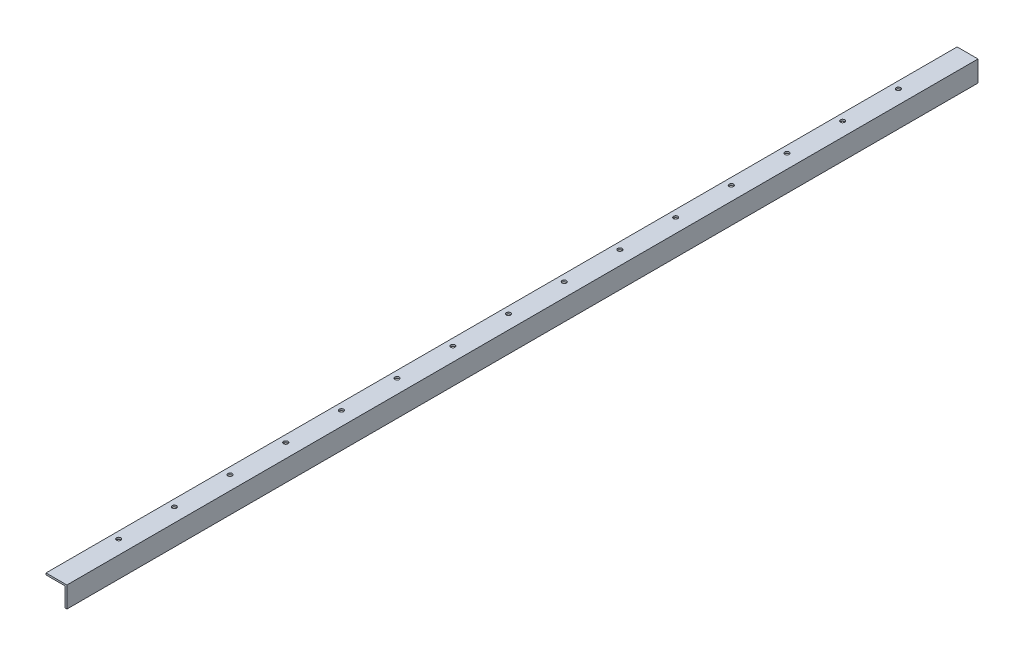
ISO-10303-21;
HEADER;
FILE_DESCRIPTION(('STEP AP214'),'2;1');
FILE_NAME('part.step','',(''),(''),'','','');
FILE_SCHEMA(('AUTOMOTIVE_DESIGN { 1 0 10303 214 1 1 1 1 }'));
ENDSEC;
DATA;
#1=APPLICATION_CONTEXT('core data for automotive mechanical design processes');
#2=APPLICATION_PROTOCOL_DEFINITION('international standard','automotive_design',2000,#1);
#3=PRODUCT_CONTEXT('',#1,'mechanical');
#4=PRODUCT('Part','Part','',(#3));
#5=PRODUCT_RELATED_PRODUCT_CATEGORY('part','',(#4));
#6=PRODUCT_DEFINITION_FORMATION('','',#4);
#7=PRODUCT_DEFINITION_CONTEXT('part definition',#1,'design');
#8=PRODUCT_DEFINITION('design','',#6,#7);
#9=PRODUCT_DEFINITION_SHAPE('','',#8);
#10=(LENGTH_UNIT() NAMED_UNIT(*) SI_UNIT(.MILLI.,.METRE.));
#11=(NAMED_UNIT(*) PLANE_ANGLE_UNIT() SI_UNIT($,.RADIAN.));
#12=(NAMED_UNIT(*) SI_UNIT($,.STERADIAN.) SOLID_ANGLE_UNIT());
#13=UNCERTAINTY_MEASURE_WITH_UNIT(LENGTH_MEASURE(1.E-05),#10,'distance_accuracy_value','');
#14=(GEOMETRIC_REPRESENTATION_CONTEXT(3) GLOBAL_UNCERTAINTY_ASSIGNED_CONTEXT((#13)) GLOBAL_UNIT_ASSIGNED_CONTEXT((#10,
#11,#12)) REPRESENTATION_CONTEXT('',''));
#15=CARTESIAN_POINT('',(0.,0.,0.));
#16=DIRECTION('',(0.,0.,1.));
#17=DIRECTION('',(1.,0.,0.));
#18=AXIS2_PLACEMENT_3D('',#15,#16,#17);
#19=CARTESIAN_POINT('',(-25.4,-41.275,1542.25625));
#20=DIRECTION('',(0.,1.,0.));
#21=DIRECTION('',(0.,0.,1.));
#22=AXIS2_PLACEMENT_3D('',#19,#20,#21);
#23=CYLINDRICAL_SURFACE('',#22,3.96874999999999);
#24=CARTESIAN_POINT('',(-25.4,-3.175,1542.25625));
#25=DIRECTION('',(0.,1.,0.));
#26=DIRECTION('',(0.,0.,1.));
#27=AXIS2_PLACEMENT_3D('',#24,#25,#26);
#28=CIRCLE('',#27,3.96874999999999);
#29=CARTESIAN_POINT('',(-25.4,-3.175,1546.225));
#30=VERTEX_POINT('',#29);
#31=EDGE_CURVE('E52',#30,#30,#28,.T.);
#32=ORIENTED_EDGE('',*,*,#31,.F.);
#33=EDGE_LOOP('',(#32));
#34=FACE_BOUND('',#33,.T.);
#35=CARTESIAN_POINT('',(-25.4,0.,1542.25625));
#36=DIRECTION('',(0.,-1.,0.));
#37=DIRECTION('',(1.,0.,0.));
#38=AXIS2_PLACEMENT_3D('',#35,#36,#37);
#39=CIRCLE('',#38,3.96874999999999);
#40=CARTESIAN_POINT('',(-21.43125,0.,1542.25625));
#41=VERTEX_POINT('',#40);
#42=EDGE_CURVE('E13',#41,#41,#39,.T.);
#43=ORIENTED_EDGE('',*,*,#42,.F.);
#44=EDGE_LOOP('',(#43));
#45=FACE_BOUND('',#44,.T.);
#46=ADVANCED_FACE('F44',(#34,#45),#23,.F.);
#47=CARTESIAN_POINT('',(-25.4,-41.275,1440.65625));
#48=DIRECTION('',(0.,1.,0.));
#49=DIRECTION('',(0.,0.,1.));
#50=AXIS2_PLACEMENT_3D('',#47,#48,#49);
#51=CYLINDRICAL_SURFACE('',#50,3.96874999999999);
#52=CARTESIAN_POINT('',(-25.4,-3.175,1440.65625));
#53=DIRECTION('',(0.,1.,0.));
#54=DIRECTION('',(0.,0.,1.));
#55=AXIS2_PLACEMENT_3D('',#52,#53,#54);
#56=CIRCLE('',#55,3.96874999999999);
#57=CARTESIAN_POINT('',(-25.4,-3.175,1444.625));
#58=VERTEX_POINT('',#57);
#59=EDGE_CURVE('E220',#58,#58,#56,.T.);
#60=ORIENTED_EDGE('',*,*,#59,.F.);
#61=EDGE_LOOP('',(#60));
#62=FACE_BOUND('',#61,.T.);
#63=CARTESIAN_POINT('',(-25.4,0.,1440.65625));
#64=DIRECTION('',(0.,-1.,0.));
#65=DIRECTION('',(1.,0.,0.));
#66=AXIS2_PLACEMENT_3D('',#63,#64,#65);
#67=CIRCLE('',#66,3.96874999999999);
#68=CARTESIAN_POINT('',(-21.43125,0.,1440.65625));
#69=VERTEX_POINT('',#68);
#70=EDGE_CURVE('E223',#69,#69,#67,.T.);
#71=ORIENTED_EDGE('',*,*,#70,.F.);
#72=EDGE_LOOP('',(#71));
#73=FACE_BOUND('',#72,.T.);
#74=ADVANCED_FACE('F231',(#62,#73),#51,.F.);
#75=CARTESIAN_POINT('',(-25.4,-41.275,1339.05625));
#76=DIRECTION('',(0.,1.,0.));
#77=DIRECTION('',(0.,0.,1.));
#78=AXIS2_PLACEMENT_3D('',#75,#76,#77);
#79=CYLINDRICAL_SURFACE('',#78,3.96874999999999);
#80=CARTESIAN_POINT('',(-25.4,-3.175,1339.05625));
#81=DIRECTION('',(0.,1.,0.));
#82=DIRECTION('',(0.,0.,1.));
#83=AXIS2_PLACEMENT_3D('',#80,#81,#82);
#84=CIRCLE('',#83,3.96874999999999);
#85=CARTESIAN_POINT('',(-25.4,-3.175,1343.025));
#86=VERTEX_POINT('',#85);
#87=EDGE_CURVE('E214',#86,#86,#84,.T.);
#88=ORIENTED_EDGE('',*,*,#87,.F.);
#89=EDGE_LOOP('',(#88));
#90=FACE_BOUND('',#89,.T.);
#91=CARTESIAN_POINT('',(-25.4,0.,1339.05625));
#92=DIRECTION('',(0.,-1.,0.));
#93=DIRECTION('',(1.,0.,0.));
#94=AXIS2_PLACEMENT_3D('',#91,#92,#93);
#95=CIRCLE('',#94,3.96874999999999);
#96=CARTESIAN_POINT('',(-21.43125,0.,1339.05625));
#97=VERTEX_POINT('',#96);
#98=EDGE_CURVE('E217',#97,#97,#95,.T.);
#99=ORIENTED_EDGE('',*,*,#98,.F.);
#100=EDGE_LOOP('',(#99));
#101=FACE_BOUND('',#100,.T.);
#102=ADVANCED_FACE('F291',(#90,#101),#79,.F.);
#103=CARTESIAN_POINT('',(-25.4,-41.275,1237.45625));
#104=DIRECTION('',(0.,1.,0.));
#105=DIRECTION('',(0.,0.,1.));
#106=AXIS2_PLACEMENT_3D('',#103,#104,#105);
#107=CYLINDRICAL_SURFACE('',#106,3.96874999999999);
#108=CARTESIAN_POINT('',(-25.4,-3.175,1237.45625));
#109=DIRECTION('',(0.,1.,0.));
#110=DIRECTION('',(0.,0.,1.));
#111=AXIS2_PLACEMENT_3D('',#108,#109,#110);
#112=CIRCLE('',#111,3.96874999999999);
#113=CARTESIAN_POINT('',(-25.4,-3.175,1241.425));
#114=VERTEX_POINT('',#113);
#115=EDGE_CURVE('E208',#114,#114,#112,.T.);
#116=ORIENTED_EDGE('',*,*,#115,.F.);
#117=EDGE_LOOP('',(#116));
#118=FACE_BOUND('',#117,.T.);
#119=CARTESIAN_POINT('',(-25.4,0.,1237.45625));
#120=DIRECTION('',(0.,-1.,0.));
#121=DIRECTION('',(1.,0.,0.));
#122=AXIS2_PLACEMENT_3D('',#119,#120,#121);
#123=CIRCLE('',#122,3.96874999999999);
#124=CARTESIAN_POINT('',(-21.43125,0.,1237.45625));
#125=VERTEX_POINT('',#124);
#126=EDGE_CURVE('E211',#125,#125,#123,.T.);
#127=ORIENTED_EDGE('',*,*,#126,.F.);
#128=EDGE_LOOP('',(#127));
#129=FACE_BOUND('',#128,.T.);
#130=ADVANCED_FACE('F287',(#118,#129),#107,.F.);
#131=CARTESIAN_POINT('',(-25.4,-41.275,1135.85625));
#132=DIRECTION('',(0.,1.,0.));
#133=DIRECTION('',(0.,0.,1.));
#134=AXIS2_PLACEMENT_3D('',#131,#132,#133);
#135=CYLINDRICAL_SURFACE('',#134,3.96874999999999);
#136=CARTESIAN_POINT('',(-25.4,-3.175,1135.85625));
#137=DIRECTION('',(0.,1.,0.));
#138=DIRECTION('',(0.,0.,1.));
#139=AXIS2_PLACEMENT_3D('',#136,#137,#138);
#140=CIRCLE('',#139,3.96874999999999);
#141=CARTESIAN_POINT('',(-25.4,-3.175,1139.825));
#142=VERTEX_POINT('',#141);
#143=EDGE_CURVE('E202',#142,#142,#140,.T.);
#144=ORIENTED_EDGE('',*,*,#143,.F.);
#145=EDGE_LOOP('',(#144));
#146=FACE_BOUND('',#145,.T.);
#147=CARTESIAN_POINT('',(-25.4,0.,1135.85625));
#148=DIRECTION('',(0.,-1.,0.));
#149=DIRECTION('',(1.,0.,0.));
#150=AXIS2_PLACEMENT_3D('',#147,#148,#149);
#151=CIRCLE('',#150,3.96874999999999);
#152=CARTESIAN_POINT('',(-21.43125,0.,1135.85625));
#153=VERTEX_POINT('',#152);
#154=EDGE_CURVE('E205',#153,#153,#151,.T.);
#155=ORIENTED_EDGE('',*,*,#154,.F.);
#156=EDGE_LOOP('',(#155));
#157=FACE_BOUND('',#156,.T.);
#158=ADVANCED_FACE('F283',(#146,#157),#135,.F.);
#159=CARTESIAN_POINT('',(-25.4,-41.275,1034.25625));
#160=DIRECTION('',(0.,1.,0.));
#161=DIRECTION('',(0.,0.,1.));
#162=AXIS2_PLACEMENT_3D('',#159,#160,#161);
#163=CYLINDRICAL_SURFACE('',#162,3.96874999999999);
#164=CARTESIAN_POINT('',(-25.4,-3.175,1034.25625));
#165=DIRECTION('',(0.,1.,0.));
#166=DIRECTION('',(0.,0.,1.));
#167=AXIS2_PLACEMENT_3D('',#164,#165,#166);
#168=CIRCLE('',#167,3.96874999999999);
#169=CARTESIAN_POINT('',(-25.4,-3.175,1038.225));
#170=VERTEX_POINT('',#169);
#171=EDGE_CURVE('E196',#170,#170,#168,.T.);
#172=ORIENTED_EDGE('',*,*,#171,.F.);
#173=EDGE_LOOP('',(#172));
#174=FACE_BOUND('',#173,.T.);
#175=CARTESIAN_POINT('',(-25.4,0.,1034.25625));
#176=DIRECTION('',(0.,-1.,0.));
#177=DIRECTION('',(1.,0.,0.));
#178=AXIS2_PLACEMENT_3D('',#175,#176,#177);
#179=CIRCLE('',#178,3.96874999999999);
#180=CARTESIAN_POINT('',(-21.43125,0.,1034.25625));
#181=VERTEX_POINT('',#180);
#182=EDGE_CURVE('E199',#181,#181,#179,.T.);
#183=ORIENTED_EDGE('',*,*,#182,.F.);
#184=EDGE_LOOP('',(#183));
#185=FACE_BOUND('',#184,.T.);
#186=ADVANCED_FACE('F279',(#174,#185),#163,.F.);
#187=CARTESIAN_POINT('',(-25.4,-41.275,932.65625));
#188=DIRECTION('',(0.,1.,0.));
#189=DIRECTION('',(0.,0.,1.));
#190=AXIS2_PLACEMENT_3D('',#187,#188,#189);
#191=CYLINDRICAL_SURFACE('',#190,3.96874999999999);
#192=CARTESIAN_POINT('',(-25.4,-3.175,932.65625));
#193=DIRECTION('',(0.,1.,0.));
#194=DIRECTION('',(0.,0.,1.));
#195=AXIS2_PLACEMENT_3D('',#192,#193,#194);
#196=CIRCLE('',#195,3.96874999999999);
#197=CARTESIAN_POINT('',(-25.4,-3.175,936.625));
#198=VERTEX_POINT('',#197);
#199=EDGE_CURVE('E190',#198,#198,#196,.T.);
#200=ORIENTED_EDGE('',*,*,#199,.F.);
#201=EDGE_LOOP('',(#200));
#202=FACE_BOUND('',#201,.T.);
#203=CARTESIAN_POINT('',(-25.4,0.,932.65625));
#204=DIRECTION('',(0.,-1.,0.));
#205=DIRECTION('',(1.,0.,0.));
#206=AXIS2_PLACEMENT_3D('',#203,#204,#205);
#207=CIRCLE('',#206,3.96874999999999);
#208=CARTESIAN_POINT('',(-21.43125,0.,932.65625));
#209=VERTEX_POINT('',#208);
#210=EDGE_CURVE('E193',#209,#209,#207,.T.);
#211=ORIENTED_EDGE('',*,*,#210,.F.);
#212=EDGE_LOOP('',(#211));
#213=FACE_BOUND('',#212,.T.);
#214=ADVANCED_FACE('F275',(#202,#213),#191,.F.);
#215=CARTESIAN_POINT('',(-25.4,-41.275,831.05625));
#216=DIRECTION('',(0.,1.,0.));
#217=DIRECTION('',(0.,0.,1.));
#218=AXIS2_PLACEMENT_3D('',#215,#216,#217);
#219=CYLINDRICAL_SURFACE('',#218,3.96874999999999);
#220=CARTESIAN_POINT('',(-25.4,-3.175,831.05625));
#221=DIRECTION('',(0.,1.,0.));
#222=DIRECTION('',(0.,0.,1.));
#223=AXIS2_PLACEMENT_3D('',#220,#221,#222);
#224=CIRCLE('',#223,3.96874999999999);
#225=CARTESIAN_POINT('',(-25.4,-3.175,835.025));
#226=VERTEX_POINT('',#225);
#227=EDGE_CURVE('E184',#226,#226,#224,.T.);
#228=ORIENTED_EDGE('',*,*,#227,.F.);
#229=EDGE_LOOP('',(#228));
#230=FACE_BOUND('',#229,.T.);
#231=CARTESIAN_POINT('',(-25.4,0.,831.05625));
#232=DIRECTION('',(0.,-1.,0.));
#233=DIRECTION('',(1.,0.,0.));
#234=AXIS2_PLACEMENT_3D('',#231,#232,#233);
#235=CIRCLE('',#234,3.96874999999999);
#236=CARTESIAN_POINT('',(-21.43125,0.,831.05625));
#237=VERTEX_POINT('',#236);
#238=EDGE_CURVE('E187',#237,#237,#235,.T.);
#239=ORIENTED_EDGE('',*,*,#238,.F.);
#240=EDGE_LOOP('',(#239));
#241=FACE_BOUND('',#240,.T.);
#242=ADVANCED_FACE('F271',(#230,#241),#219,.F.);
#243=CARTESIAN_POINT('',(-25.4,-41.275,729.45625));
#244=DIRECTION('',(0.,1.,0.));
#245=DIRECTION('',(0.,0.,1.));
#246=AXIS2_PLACEMENT_3D('',#243,#244,#245);
#247=CYLINDRICAL_SURFACE('',#246,3.96874999999999);
#248=CARTESIAN_POINT('',(-25.4,-3.175,729.45625));
#249=DIRECTION('',(0.,1.,0.));
#250=DIRECTION('',(0.,0.,1.));
#251=AXIS2_PLACEMENT_3D('',#248,#249,#250);
#252=CIRCLE('',#251,3.96874999999999);
#253=CARTESIAN_POINT('',(-25.4,-3.175,733.425));
#254=VERTEX_POINT('',#253);
#255=EDGE_CURVE('E178',#254,#254,#252,.T.);
#256=ORIENTED_EDGE('',*,*,#255,.F.);
#257=EDGE_LOOP('',(#256));
#258=FACE_BOUND('',#257,.T.);
#259=CARTESIAN_POINT('',(-25.4,0.,729.45625));
#260=DIRECTION('',(0.,-1.,0.));
#261=DIRECTION('',(1.,0.,0.));
#262=AXIS2_PLACEMENT_3D('',#259,#260,#261);
#263=CIRCLE('',#262,3.96874999999999);
#264=CARTESIAN_POINT('',(-21.43125,0.,729.45625));
#265=VERTEX_POINT('',#264);
#266=EDGE_CURVE('E181',#265,#265,#263,.T.);
#267=ORIENTED_EDGE('',*,*,#266,.F.);
#268=EDGE_LOOP('',(#267));
#269=FACE_BOUND('',#268,.T.);
#270=ADVANCED_FACE('F267',(#258,#269),#247,.F.);
#271=CARTESIAN_POINT('',(-25.4,-41.275,627.85625));
#272=DIRECTION('',(0.,1.,0.));
#273=DIRECTION('',(0.,0.,1.));
#274=AXIS2_PLACEMENT_3D('',#271,#272,#273);
#275=CYLINDRICAL_SURFACE('',#274,3.96874999999999);
#276=CARTESIAN_POINT('',(-25.4,-3.175,627.85625));
#277=DIRECTION('',(0.,1.,0.));
#278=DIRECTION('',(0.,0.,1.));
#279=AXIS2_PLACEMENT_3D('',#276,#277,#278);
#280=CIRCLE('',#279,3.96874999999999);
#281=CARTESIAN_POINT('',(-25.4,-3.175,631.825));
#282=VERTEX_POINT('',#281);
#283=EDGE_CURVE('E172',#282,#282,#280,.T.);
#284=ORIENTED_EDGE('',*,*,#283,.F.);
#285=EDGE_LOOP('',(#284));
#286=FACE_BOUND('',#285,.T.);
#287=CARTESIAN_POINT('',(-25.4,0.,627.85625));
#288=DIRECTION('',(0.,-1.,0.));
#289=DIRECTION('',(1.,0.,0.));
#290=AXIS2_PLACEMENT_3D('',#287,#288,#289);
#291=CIRCLE('',#290,3.96874999999999);
#292=CARTESIAN_POINT('',(-21.43125,0.,627.85625));
#293=VERTEX_POINT('',#292);
#294=EDGE_CURVE('E175',#293,#293,#291,.T.);
#295=ORIENTED_EDGE('',*,*,#294,.F.);
#296=EDGE_LOOP('',(#295));
#297=FACE_BOUND('',#296,.T.);
#298=ADVANCED_FACE('F263',(#286,#297),#275,.F.);
#299=CARTESIAN_POINT('',(-25.4,-41.275,526.25625));
#300=DIRECTION('',(0.,1.,0.));
#301=DIRECTION('',(0.,0.,1.));
#302=AXIS2_PLACEMENT_3D('',#299,#300,#301);
#303=CYLINDRICAL_SURFACE('',#302,3.96874999999999);
#304=CARTESIAN_POINT('',(-25.4,-3.175,526.25625));
#305=DIRECTION('',(0.,1.,0.));
#306=DIRECTION('',(0.,0.,1.));
#307=AXIS2_PLACEMENT_3D('',#304,#305,#306);
#308=CIRCLE('',#307,3.96874999999999);
#309=CARTESIAN_POINT('',(-25.4,-3.175,530.225));
#310=VERTEX_POINT('',#309);
#311=EDGE_CURVE('E166',#310,#310,#308,.T.);
#312=ORIENTED_EDGE('',*,*,#311,.F.);
#313=EDGE_LOOP('',(#312));
#314=FACE_BOUND('',#313,.T.);
#315=CARTESIAN_POINT('',(-25.4,0.,526.25625));
#316=DIRECTION('',(0.,-1.,0.));
#317=DIRECTION('',(1.,0.,0.));
#318=AXIS2_PLACEMENT_3D('',#315,#316,#317);
#319=CIRCLE('',#318,3.96874999999999);
#320=CARTESIAN_POINT('',(-21.43125,0.,526.25625));
#321=VERTEX_POINT('',#320);
#322=EDGE_CURVE('E169',#321,#321,#319,.T.);
#323=ORIENTED_EDGE('',*,*,#322,.F.);
#324=EDGE_LOOP('',(#323));
#325=FACE_BOUND('',#324,.T.);
#326=ADVANCED_FACE('F259',(#314,#325),#303,.F.);
#327=CARTESIAN_POINT('',(-25.4,-41.275,424.65625));
#328=DIRECTION('',(0.,1.,0.));
#329=DIRECTION('',(0.,0.,1.));
#330=AXIS2_PLACEMENT_3D('',#327,#328,#329);
#331=CYLINDRICAL_SURFACE('',#330,3.96874999999999);
#332=CARTESIAN_POINT('',(-25.4,-3.175,424.65625));
#333=DIRECTION('',(0.,1.,0.));
#334=DIRECTION('',(0.,0.,1.));
#335=AXIS2_PLACEMENT_3D('',#332,#333,#334);
#336=CIRCLE('',#335,3.96874999999999);
#337=CARTESIAN_POINT('',(-25.4,-3.175,428.625));
#338=VERTEX_POINT('',#337);
#339=EDGE_CURVE('E160',#338,#338,#336,.T.);
#340=ORIENTED_EDGE('',*,*,#339,.F.);
#341=EDGE_LOOP('',(#340));
#342=FACE_BOUND('',#341,.T.);
#343=CARTESIAN_POINT('',(-25.4,0.,424.65625));
#344=DIRECTION('',(0.,-1.,0.));
#345=DIRECTION('',(1.,0.,0.));
#346=AXIS2_PLACEMENT_3D('',#343,#344,#345);
#347=CIRCLE('',#346,3.96874999999999);
#348=CARTESIAN_POINT('',(-21.43125,0.,424.65625));
#349=VERTEX_POINT('',#348);
#350=EDGE_CURVE('E163',#349,#349,#347,.T.);
#351=ORIENTED_EDGE('',*,*,#350,.F.);
#352=EDGE_LOOP('',(#351));
#353=FACE_BOUND('',#352,.T.);
#354=ADVANCED_FACE('F255',(#342,#353),#331,.F.);
#355=CARTESIAN_POINT('',(-25.4,-41.275,323.05625));
#356=DIRECTION('',(0.,1.,0.));
#357=DIRECTION('',(0.,0.,1.));
#358=AXIS2_PLACEMENT_3D('',#355,#356,#357);
#359=CYLINDRICAL_SURFACE('',#358,3.96874999999999);
#360=CARTESIAN_POINT('',(-25.4,-3.175,323.05625));
#361=DIRECTION('',(0.,1.,0.));
#362=DIRECTION('',(0.,0.,1.));
#363=AXIS2_PLACEMENT_3D('',#360,#361,#362);
#364=CIRCLE('',#363,3.96874999999999);
#365=CARTESIAN_POINT('',(-25.4,-3.175,327.025));
#366=VERTEX_POINT('',#365);
#367=EDGE_CURVE('E150',#366,#366,#364,.T.);
#368=ORIENTED_EDGE('',*,*,#367,.F.);
#369=EDGE_LOOP('',(#368));
#370=FACE_BOUND('',#369,.T.);
#371=CARTESIAN_POINT('',(-25.4,0.,323.05625));
#372=DIRECTION('',(0.,-1.,0.));
#373=DIRECTION('',(1.,0.,0.));
#374=AXIS2_PLACEMENT_3D('',#371,#372,#373);
#375=CIRCLE('',#374,3.96874999999999);
#376=CARTESIAN_POINT('',(-21.43125,0.,323.05625));
#377=VERTEX_POINT('',#376);
#378=EDGE_CURVE('E157',#377,#377,#375,.T.);
#379=ORIENTED_EDGE('',*,*,#378,.F.);
#380=EDGE_LOOP('',(#379));
#381=FACE_BOUND('',#380,.T.);
#382=ADVANCED_FACE('F246',(#370,#381),#359,.F.);
#383=CARTESIAN_POINT('',(0.,-38.1,1662.1125));
#384=DIRECTION('',(-1.,0.,0.));
#385=DIRECTION('',(0.,0.,1.));
#386=AXIS2_PLACEMENT_3D('',#383,#384,#385);
#387=PLANE('',#386);
#388=DIRECTION('',(0.,1.,0.));
#389=VECTOR('',#388,1.);
#390=CARTESIAN_POINT('',(0.,-38.1,0.));
#391=LINE('',#390,#389);
#392=CARTESIAN_POINT('',(0.,-38.1,0.));
#393=VERTEX_POINT('',#392);
#394=CARTESIAN_POINT('',(0.,0.,0.));
#395=VERTEX_POINT('',#394);
#396=EDGE_CURVE('E130',#393,#395,#391,.T.);
#397=ORIENTED_EDGE('',*,*,#396,.T.);
#398=DIRECTION('',(0.,0.,-1.));
#399=VECTOR('',#398,1.);
#400=CARTESIAN_POINT('',(0.,0.,1662.1125));
#401=LINE('',#400,#399);
#402=CARTESIAN_POINT('',(0.,0.,1662.1125));
#403=VERTEX_POINT('',#402);
#404=EDGE_CURVE('E148',#403,#395,#401,.T.);
#405=ORIENTED_EDGE('',*,*,#404,.F.);
#406=DIRECTION('',(0.,1.,0.));
#407=VECTOR('',#406,1.);
#408=CARTESIAN_POINT('',(0.,-38.1,1662.1125));
#409=LINE('',#408,#407);
#410=CARTESIAN_POINT('',(0.,-38.1,1662.1125));
#411=VERTEX_POINT('',#410);
#412=EDGE_CURVE('E141',#411,#403,#409,.T.);
#413=ORIENTED_EDGE('',*,*,#412,.F.);
#414=DIRECTION('',(0.,0.,-1.));
#415=VECTOR('',#414,1.);
#416=CARTESIAN_POINT('',(0.,-38.1,1662.1125));
#417=LINE('',#416,#415);
#418=EDGE_CURVE('E126',#411,#393,#417,.T.);
#419=ORIENTED_EDGE('',*,*,#418,.T.);
#420=EDGE_LOOP('',(#397,#405,#413,#419));
#421=FACE_BOUND('',#420,.T.);
#422=ADVANCED_FACE('F237',(#421),#387,.F.);
#423=CARTESIAN_POINT('',(0.,0.,1662.1125));
#424=DIRECTION('',(0.,-1.,0.));
#425=DIRECTION('',(1.,0.,0.));
#426=AXIS2_PLACEMENT_3D('',#423,#424,#425);
#427=PLANE('',#426);
#428=CARTESIAN_POINT('',(-25.4,0.,221.45625));
#429=DIRECTION('',(0.,-1.,0.));
#430=DIRECTION('',(1.,0.,0.));
#431=AXIS2_PLACEMENT_3D('',#428,#429,#430);
#432=CIRCLE('',#431,3.96874999999999);
#433=CARTESIAN_POINT('',(-21.43125,0.,221.45625));
#434=VERTEX_POINT('',#433);
#435=EDGE_CURVE('E154',#434,#434,#432,.T.);
#436=ORIENTED_EDGE('',*,*,#435,.T.);
#437=EDGE_LOOP('',(#436));
#438=FACE_BOUND('',#437,.T.);
#439=CARTESIAN_POINT('',(-25.4,0.,119.85625));
#440=DIRECTION('',(0.,-1.,0.));
#441=DIRECTION('',(1.,0.,0.));
#442=AXIS2_PLACEMENT_3D('',#439,#440,#441);
#443=CIRCLE('',#442,3.96874999999999);
#444=CARTESIAN_POINT('',(-21.43125,0.,119.85625));
#445=VERTEX_POINT('',#444);
#446=EDGE_CURVE('E134',#445,#445,#443,.T.);
#447=ORIENTED_EDGE('',*,*,#446,.T.);
#448=EDGE_LOOP('',(#447));
#449=FACE_BOUND('',#448,.T.);
#450=DIRECTION('',(-1.,0.,0.));
#451=VECTOR('',#450,1.);
#452=CARTESIAN_POINT('',(0.,0.,0.));
#453=LINE('',#452,#451);
#454=CARTESIAN_POINT('',(-38.1,0.,0.));
#455=VERTEX_POINT('',#454);
#456=EDGE_CURVE('E133',#395,#455,#453,.T.);
#457=ORIENTED_EDGE('',*,*,#456,.T.);
#458=DIRECTION('',(0.,0.,-1.));
#459=VECTOR('',#458,1.);
#460=CARTESIAN_POINT('',(-38.1,0.,1662.1125));
#461=LINE('',#460,#459);
#462=CARTESIAN_POINT('',(-38.1,0.,1662.1125));
#463=VERTEX_POINT('',#462);
#464=EDGE_CURVE('E145',#463,#455,#461,.T.);
#465=ORIENTED_EDGE('',*,*,#464,.F.);
#466=DIRECTION('',(-1.,0.,0.));
#467=VECTOR('',#466,1.);
#468=CARTESIAN_POINT('',(0.,0.,1662.1125));
#469=LINE('',#468,#467);
#470=EDGE_CURVE('E98',#403,#463,#469,.T.);
#471=ORIENTED_EDGE('',*,*,#470,.F.);
#472=ORIENTED_EDGE('',*,*,#404,.T.);
#473=EDGE_LOOP('',(#457,#465,#471,#472));
#474=FACE_BOUND('',#473,.T.);
#475=ORIENTED_EDGE('',*,*,#378,.T.);
#476=EDGE_LOOP('',(#475));
#477=FACE_BOUND('',#476,.T.);
#478=ORIENTED_EDGE('',*,*,#350,.T.);
#479=EDGE_LOOP('',(#478));
#480=FACE_BOUND('',#479,.T.);
#481=ORIENTED_EDGE('',*,*,#322,.T.);
#482=EDGE_LOOP('',(#481));
#483=FACE_BOUND('',#482,.T.);
#484=ORIENTED_EDGE('',*,*,#294,.T.);
#485=EDGE_LOOP('',(#484));
#486=FACE_BOUND('',#485,.T.);
#487=ORIENTED_EDGE('',*,*,#266,.T.);
#488=EDGE_LOOP('',(#487));
#489=FACE_BOUND('',#488,.T.);
#490=ORIENTED_EDGE('',*,*,#238,.T.);
#491=EDGE_LOOP('',(#490));
#492=FACE_BOUND('',#491,.T.);
#493=ORIENTED_EDGE('',*,*,#210,.T.);
#494=EDGE_LOOP('',(#493));
#495=FACE_BOUND('',#494,.T.);
#496=ORIENTED_EDGE('',*,*,#182,.T.);
#497=EDGE_LOOP('',(#496));
#498=FACE_BOUND('',#497,.T.);
#499=ORIENTED_EDGE('',*,*,#154,.T.);
#500=EDGE_LOOP('',(#499));
#501=FACE_BOUND('',#500,.T.);
#502=ORIENTED_EDGE('',*,*,#126,.T.);
#503=EDGE_LOOP('',(#502));
#504=FACE_BOUND('',#503,.T.);
#505=ORIENTED_EDGE('',*,*,#98,.T.);
#506=EDGE_LOOP('',(#505));
#507=FACE_BOUND('',#506,.T.);
#508=ORIENTED_EDGE('',*,*,#70,.T.);
#509=EDGE_LOOP('',(#508));
#510=FACE_BOUND('',#509,.T.);
#511=ORIENTED_EDGE('',*,*,#42,.T.);
#512=EDGE_LOOP('',(#511));
#513=FACE_BOUND('',#512,.T.);
#514=ADVANCED_FACE('F234',(#438,#449,#474,#477,#480,#483,#486,#489,#492,#495,#498,#501,#504,
#507,#510,#513),#427,.F.);
#515=CARTESIAN_POINT('',(-38.1,0.,1662.1125));
#516=DIRECTION('',(1.,0.,0.));
#517=DIRECTION('',(0.,0.,-1.));
#518=AXIS2_PLACEMENT_3D('',#515,#516,#517);
#519=PLANE('',#518);
#520=DIRECTION('',(0.,-1.,0.));
#521=VECTOR('',#520,1.);
#522=CARTESIAN_POINT('',(-38.1,0.,0.));
#523=LINE('',#522,#521);
#524=CARTESIAN_POINT('',(-38.1,-3.17500000000001,0.));
#525=VERTEX_POINT('',#524);
#526=EDGE_CURVE('E136',#455,#525,#523,.T.);
#527=ORIENTED_EDGE('',*,*,#526,.T.);
#528=DIRECTION('',(0.,0.,-1.));
#529=VECTOR('',#528,1.);
#530=CARTESIAN_POINT('',(-38.1,-3.17500000000001,1662.1125));
#531=LINE('',#530,#529);
#532=CARTESIAN_POINT('',(-38.1,-3.17500000000001,1662.1125));
#533=VERTEX_POINT('',#532);
#534=EDGE_CURVE('E121',#533,#525,#531,.T.);
#535=ORIENTED_EDGE('',*,*,#534,.F.);
#536=DIRECTION('',(0.,-1.,0.));
#537=VECTOR('',#536,1.);
#538=CARTESIAN_POINT('',(-38.1,0.,1662.1125));
#539=LINE('',#538,#537);
#540=EDGE_CURVE('E111',#463,#533,#539,.T.);
#541=ORIENTED_EDGE('',*,*,#540,.F.);
#542=ORIENTED_EDGE('',*,*,#464,.T.);
#543=EDGE_LOOP('',(#527,#535,#541,#542));
#544=FACE_BOUND('',#543,.T.);
#545=ADVANCED_FACE('F236',(#544),#519,.F.);
#546=CARTESIAN_POINT('',(-38.1,-3.17500000000001,1662.1125));
#547=DIRECTION('',(0.,1.,0.));
#548=DIRECTION('',(0.,0.,1.));
#549=AXIS2_PLACEMENT_3D('',#546,#547,#548);
#550=PLANE('',#549);
#551=CARTESIAN_POINT('',(-25.4,-3.175,221.45625));
#552=DIRECTION('',(0.,1.,0.));
#553=DIRECTION('',(0.,0.,1.));
#554=AXIS2_PLACEMENT_3D('',#551,#552,#553);
#555=CIRCLE('',#554,3.96874999999999);
#556=CARTESIAN_POINT('',(-25.4,-3.175,225.425));
#557=VERTEX_POINT('',#556);
#558=EDGE_CURVE('E333',#557,#557,#555,.T.);
#559=ORIENTED_EDGE('',*,*,#558,.T.);
#560=EDGE_LOOP('',(#559));
#561=FACE_BOUND('',#560,.T.);
#562=CARTESIAN_POINT('',(-25.4,-3.175,119.85625));
#563=DIRECTION('',(0.,1.,0.));
#564=DIRECTION('',(0.,0.,1.));
#565=AXIS2_PLACEMENT_3D('',#562,#563,#564);
#566=CIRCLE('',#565,3.96874999999999);
#567=CARTESIAN_POINT('',(-25.4,-3.175,123.825));
#568=VERTEX_POINT('',#567);
#569=EDGE_CURVE('E151',#568,#568,#566,.T.);
#570=ORIENTED_EDGE('',*,*,#569,.T.);
#571=EDGE_LOOP('',(#570));
#572=FACE_BOUND('',#571,.T.);
#573=DIRECTION('',(1.,0.,0.));
#574=VECTOR('',#573,1.);
#575=CARTESIAN_POINT('',(-38.1,-3.17500000000001,0.));
#576=LINE('',#575,#574);
#577=CARTESIAN_POINT('',(-3.17500000000001,-3.17500000000001,0.));
#578=VERTEX_POINT('',#577);
#579=EDGE_CURVE('E120',#525,#578,#576,.T.);
#580=ORIENTED_EDGE('',*,*,#579,.T.);
#581=DIRECTION('',(0.,0.,-1.));
#582=VECTOR('',#581,1.);
#583=CARTESIAN_POINT('',(-3.17500000000001,-3.17500000000001,1662.1125));
#584=LINE('',#583,#582);
#585=CARTESIAN_POINT('',(-3.17500000000001,-3.17500000000001,1662.1125));
#586=VERTEX_POINT('',#585);
#587=EDGE_CURVE('E116',#586,#578,#584,.T.);
#588=ORIENTED_EDGE('',*,*,#587,.F.);
#589=DIRECTION('',(1.,0.,0.));
#590=VECTOR('',#589,1.);
#591=CARTESIAN_POINT('',(-38.1,-3.17500000000001,1662.1125));
#592=LINE('',#591,#590);
#593=EDGE_CURVE('E105',#533,#586,#592,.T.);
#594=ORIENTED_EDGE('',*,*,#593,.F.);
#595=ORIENTED_EDGE('',*,*,#534,.T.);
#596=EDGE_LOOP('',(#580,#588,#594,#595));
#597=FACE_BOUND('',#596,.T.);
#598=ORIENTED_EDGE('',*,*,#367,.T.);
#599=EDGE_LOOP('',(#598));
#600=FACE_BOUND('',#599,.T.);
#601=ORIENTED_EDGE('',*,*,#339,.T.);
#602=EDGE_LOOP('',(#601));
#603=FACE_BOUND('',#602,.T.);
#604=ORIENTED_EDGE('',*,*,#311,.T.);
#605=EDGE_LOOP('',(#604));
#606=FACE_BOUND('',#605,.T.);
#607=ORIENTED_EDGE('',*,*,#283,.T.);
#608=EDGE_LOOP('',(#607));
#609=FACE_BOUND('',#608,.T.);
#610=ORIENTED_EDGE('',*,*,#255,.T.);
#611=EDGE_LOOP('',(#610));
#612=FACE_BOUND('',#611,.T.);
#613=ORIENTED_EDGE('',*,*,#227,.T.);
#614=EDGE_LOOP('',(#613));
#615=FACE_BOUND('',#614,.T.);
#616=ORIENTED_EDGE('',*,*,#199,.T.);
#617=EDGE_LOOP('',(#616));
#618=FACE_BOUND('',#617,.T.);
#619=ORIENTED_EDGE('',*,*,#171,.T.);
#620=EDGE_LOOP('',(#619));
#621=FACE_BOUND('',#620,.T.);
#622=ORIENTED_EDGE('',*,*,#143,.T.);
#623=EDGE_LOOP('',(#622));
#624=FACE_BOUND('',#623,.T.);
#625=ORIENTED_EDGE('',*,*,#115,.T.);
#626=EDGE_LOOP('',(#625));
#627=FACE_BOUND('',#626,.T.);
#628=ORIENTED_EDGE('',*,*,#87,.T.);
#629=EDGE_LOOP('',(#628));
#630=FACE_BOUND('',#629,.T.);
#631=ORIENTED_EDGE('',*,*,#59,.T.);
#632=EDGE_LOOP('',(#631));
#633=FACE_BOUND('',#632,.T.);
#634=ORIENTED_EDGE('',*,*,#31,.T.);
#635=EDGE_LOOP('',(#634));
#636=FACE_BOUND('',#635,.T.);
#637=ADVANCED_FACE('F117',(#561,#572,#597,#600,#603,#606,#609,#612,#615,#618,#621,#624,#627,
#630,#633,#636),#550,.F.);
#638=CARTESIAN_POINT('',(-3.17500000000001,-3.17500000000001,1662.1125));
#639=DIRECTION('',(1.,0.,0.));
#640=DIRECTION('',(0.,1.,0.));
#641=AXIS2_PLACEMENT_3D('',#638,#639,#640);
#642=PLANE('',#641);
#643=DIRECTION('',(0.,-1.,0.));
#644=VECTOR('',#643,1.);
#645=CARTESIAN_POINT('',(-3.17500000000001,-3.17500000000001,0.));
#646=LINE('',#645,#644);
#647=CARTESIAN_POINT('',(-3.175,-38.1,0.));
#648=VERTEX_POINT('',#647);
#649=EDGE_CURVE('E83',#578,#648,#646,.T.);
#650=ORIENTED_EDGE('',*,*,#649,.T.);
#651=DIRECTION('',(0.,0.,-1.));
#652=VECTOR('',#651,1.);
#653=CARTESIAN_POINT('',(-3.175,-38.1,1662.1125));
#654=LINE('',#653,#652);
#655=CARTESIAN_POINT('',(-3.175,-38.1,1662.1125));
#656=VERTEX_POINT('',#655);
#657=EDGE_CURVE('E122',#656,#648,#654,.T.);
#658=ORIENTED_EDGE('',*,*,#657,.F.);
#659=DIRECTION('',(0.,-1.,0.));
#660=VECTOR('',#659,1.);
#661=CARTESIAN_POINT('',(-3.17500000000001,-3.17500000000001,1662.1125));
#662=LINE('',#661,#660);
#663=EDGE_CURVE('E109',#586,#656,#662,.T.);
#664=ORIENTED_EDGE('',*,*,#663,.F.);
#665=ORIENTED_EDGE('',*,*,#587,.T.);
#666=EDGE_LOOP('',(#650,#658,#664,#665));
#667=FACE_BOUND('',#666,.T.);
#668=ADVANCED_FACE('F124',(#667),#642,.F.);
#669=CARTESIAN_POINT('',(-3.175,-38.1,1662.1125));
#670=DIRECTION('',(0.,1.,0.));
#671=DIRECTION('',(0.,0.,1.));
#672=AXIS2_PLACEMENT_3D('',#669,#670,#671);
#673=PLANE('',#672);
#674=DIRECTION('',(1.,0.,0.));
#675=VECTOR('',#674,1.);
#676=CARTESIAN_POINT('',(-3.175,-38.1,0.));
#677=LINE('',#676,#675);
#678=EDGE_CURVE('E89',#648,#393,#677,.T.);
#679=ORIENTED_EDGE('',*,*,#678,.T.);
#680=ORIENTED_EDGE('',*,*,#418,.F.);
#681=DIRECTION('',(1.,0.,0.));
#682=VECTOR('',#681,1.);
#683=CARTESIAN_POINT('',(-3.175,-38.1,1662.1125));
#684=LINE('',#683,#682);
#685=EDGE_CURVE('E60',#656,#411,#684,.T.);
#686=ORIENTED_EDGE('',*,*,#685,.F.);
#687=ORIENTED_EDGE('',*,*,#657,.T.);
#688=EDGE_LOOP('',(#679,#680,#686,#687));
#689=FACE_BOUND('',#688,.T.);
#690=ADVANCED_FACE('F309',(#689),#673,.F.);
#691=CARTESIAN_POINT('',(0.,0.,1662.1125));
#692=DIRECTION('',(0.,0.,1.));
#693=DIRECTION('',(1.,0.,0.));
#694=AXIS2_PLACEMENT_3D('',#691,#692,#693);
#695=PLANE('',#694);
#696=ORIENTED_EDGE('',*,*,#412,.T.);
#697=ORIENTED_EDGE('',*,*,#470,.T.);
#698=ORIENTED_EDGE('',*,*,#540,.T.);
#699=ORIENTED_EDGE('',*,*,#593,.T.);
#700=ORIENTED_EDGE('',*,*,#663,.T.);
#701=ORIENTED_EDGE('',*,*,#685,.T.);
#702=EDGE_LOOP('',(#696,#697,#698,#699,#700,#701));
#703=FACE_BOUND('',#702,.T.);
#704=ADVANCED_FACE('F107',(#703),#695,.T.);
#705=CARTESIAN_POINT('',(0.,0.,0.));
#706=DIRECTION('',(0.,0.,1.));
#707=DIRECTION('',(1.,0.,0.));
#708=AXIS2_PLACEMENT_3D('',#705,#706,#707);
#709=PLANE('',#708);
#710=ORIENTED_EDGE('',*,*,#396,.F.);
#711=ORIENTED_EDGE('',*,*,#678,.F.);
#712=ORIENTED_EDGE('',*,*,#649,.F.);
#713=ORIENTED_EDGE('',*,*,#579,.F.);
#714=ORIENTED_EDGE('',*,*,#526,.F.);
#715=ORIENTED_EDGE('',*,*,#456,.F.);
#716=EDGE_LOOP('',(#710,#711,#712,#713,#714,#715));
#717=FACE_BOUND('',#716,.T.);
#718=ADVANCED_FACE('F316',(#717),#709,.F.);
#719=CARTESIAN_POINT('',(-25.4,-41.275,119.85625));
#720=DIRECTION('',(0.,1.,0.));
#721=DIRECTION('',(0.,0.,1.));
#722=AXIS2_PLACEMENT_3D('',#719,#720,#721);
#723=CYLINDRICAL_SURFACE('',#722,3.96874999999999);
#724=ORIENTED_EDGE('',*,*,#569,.F.);
#725=EDGE_LOOP('',(#724));
#726=FACE_BOUND('',#725,.T.);
#727=ORIENTED_EDGE('',*,*,#446,.F.);
#728=EDGE_LOOP('',(#727));
#729=FACE_BOUND('',#728,.T.);
#730=ADVANCED_FACE('F319',(#726,#729),#723,.F.);
#731=CARTESIAN_POINT('',(-25.4,-41.275,221.45625));
#732=DIRECTION('',(0.,1.,0.));
#733=DIRECTION('',(0.,0.,1.));
#734=AXIS2_PLACEMENT_3D('',#731,#732,#733);
#735=CYLINDRICAL_SURFACE('',#734,3.96874999999999);
#736=ORIENTED_EDGE('',*,*,#558,.F.);
#737=EDGE_LOOP('',(#736));
#738=FACE_BOUND('',#737,.T.);
#739=ORIENTED_EDGE('',*,*,#435,.F.);
#740=EDGE_LOOP('',(#739));
#741=FACE_BOUND('',#740,.T.);
#742=ADVANCED_FACE('F325',(#738,#741),#735,.F.);
#743=CLOSED_SHELL('',(#46,#74,#102,#130,#158,#186,#214,#242,#270,#298,#326,#354,#382,#422,#514,
#545,#637,#668,#690,#704,#718,#730,#742));
#744=MANIFOLD_SOLID_BREP('B2',#743);
#745=ADVANCED_BREP_SHAPE_REPRESENTATION('',(#18,#744),#14);
#746=SHAPE_DEFINITION_REPRESENTATION(#9,#745);
ENDSEC;
END-ISO-10303-21;
